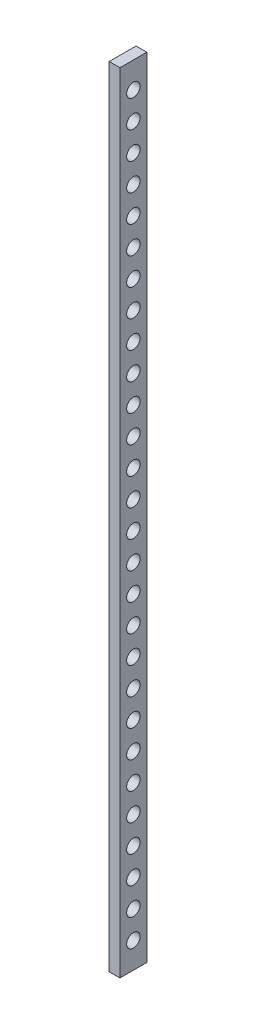
ISO-10303-21;
HEADER;
FILE_DESCRIPTION(('STEP AP214'),'2;1');
FILE_NAME('part.step','',(''),(''),'','','');
FILE_SCHEMA(('AUTOMOTIVE_DESIGN { 1 0 10303 214 1 1 1 1 }'));
ENDSEC;
DATA;
#1=APPLICATION_CONTEXT('core data for automotive mechanical design processes');
#2=APPLICATION_PROTOCOL_DEFINITION('international standard','automotive_design',2000,#1);
#3=PRODUCT_CONTEXT('',#1,'mechanical');
#4=PRODUCT('Part','Part','',(#3));
#5=PRODUCT_RELATED_PRODUCT_CATEGORY('part','',(#4));
#6=PRODUCT_DEFINITION_FORMATION('','',#4);
#7=PRODUCT_DEFINITION_CONTEXT('part definition',#1,'design');
#8=PRODUCT_DEFINITION('design','',#6,#7);
#9=PRODUCT_DEFINITION_SHAPE('','',#8);
#10=(LENGTH_UNIT() NAMED_UNIT(*) SI_UNIT(.MILLI.,.METRE.));
#11=(NAMED_UNIT(*) PLANE_ANGLE_UNIT() SI_UNIT($,.RADIAN.));
#12=(NAMED_UNIT(*) SI_UNIT($,.STERADIAN.) SOLID_ANGLE_UNIT());
#13=UNCERTAINTY_MEASURE_WITH_UNIT(LENGTH_MEASURE(1.E-05),#10,'distance_accuracy_value','');
#14=(GEOMETRIC_REPRESENTATION_CONTEXT(3) GLOBAL_UNCERTAINTY_ASSIGNED_CONTEXT((#13)) GLOBAL_UNIT_ASSIGNED_CONTEXT((#10,
#11,#12)) REPRESENTATION_CONTEXT('',''));
#15=CARTESIAN_POINT('',(0.,0.,0.));
#16=DIRECTION('',(0.,0.,1.));
#17=DIRECTION('',(1.,0.,0.));
#18=AXIS2_PLACEMENT_3D('',#15,#16,#17);
#19=CARTESIAN_POINT('',(-0.999999999999586,215.65,-2.5));
#20=DIRECTION('',(-1.,0.,0.));
#21=DIRECTION('',(0.,0.,1.));
#22=AXIS2_PLACEMENT_3D('',#19,#20,#21);
#23=PLANE('',#22);
#24=CARTESIAN_POINT('',(-0.999999999999595,210.82,0.));
#25=DIRECTION('',(-1.,0.,0.));
#26=DIRECTION('',(0.,-1.,0.));
#27=AXIS2_PLACEMENT_3D('',#24,#25,#26);
#28=CIRCLE('',#27,1.25);
#29=CARTESIAN_POINT('',(-0.999999999999597,209.57,0.));
#30=VERTEX_POINT('',#29);
#31=EDGE_CURVE('E108',#30,#30,#28,.F.);
#32=ORIENTED_EDGE('',*,*,#31,.T.);
#33=EDGE_LOOP('',(#32));
#34=FACE_BOUND('',#33,.T.);
#35=CARTESIAN_POINT('',(-0.999999999999605,205.74,0.));
#36=DIRECTION('',(-1.,0.,0.));
#37=DIRECTION('',(0.,-1.,0.));
#38=AXIS2_PLACEMENT_3D('',#35,#36,#37);
#39=CIRCLE('',#38,1.25);
#40=CARTESIAN_POINT('',(-0.999999999999607,204.49,0.));
#41=VERTEX_POINT('',#40);
#42=EDGE_CURVE('E112',#41,#41,#39,.F.);
#43=ORIENTED_EDGE('',*,*,#42,.T.);
#44=EDGE_LOOP('',(#43));
#45=FACE_BOUND('',#44,.T.);
#46=CARTESIAN_POINT('',(-0.999999999999616,200.66,0.));
#47=DIRECTION('',(-1.,0.,0.));
#48=DIRECTION('',(0.,-1.,0.));
#49=AXIS2_PLACEMENT_3D('',#46,#47,#48);
#50=CIRCLE('',#49,1.25);
#51=CARTESIAN_POINT('',(-0.999999999999618,199.41,0.));
#52=VERTEX_POINT('',#51);
#53=EDGE_CURVE('E118',#52,#52,#50,.F.);
#54=ORIENTED_EDGE('',*,*,#53,.T.);
#55=EDGE_LOOP('',(#54));
#56=FACE_BOUND('',#55,.T.);
#57=CARTESIAN_POINT('',(-0.999999999999625,195.58,0.));
#58=DIRECTION('',(-1.,0.,0.));
#59=DIRECTION('',(0.,-1.,0.));
#60=AXIS2_PLACEMENT_3D('',#57,#58,#59);
#61=CIRCLE('',#60,1.25);
#62=CARTESIAN_POINT('',(-0.999999999999627,194.33,0.));
#63=VERTEX_POINT('',#62);
#64=EDGE_CURVE('E124',#63,#63,#61,.F.);
#65=ORIENTED_EDGE('',*,*,#64,.T.);
#66=EDGE_LOOP('',(#65));
#67=FACE_BOUND('',#66,.T.);
#68=CARTESIAN_POINT('',(-0.999999999999634,190.5,0.));
#69=DIRECTION('',(-1.,0.,0.));
#70=DIRECTION('',(0.,-1.,0.));
#71=AXIS2_PLACEMENT_3D('',#68,#69,#70);
#72=CIRCLE('',#71,1.25);
#73=CARTESIAN_POINT('',(-0.999999999999637,189.25,0.));
#74=VERTEX_POINT('',#73);
#75=EDGE_CURVE('E130',#74,#74,#72,.F.);
#76=ORIENTED_EDGE('',*,*,#75,.T.);
#77=EDGE_LOOP('',(#76));
#78=FACE_BOUND('',#77,.T.);
#79=CARTESIAN_POINT('',(-0.999999999999644,185.42,0.));
#80=DIRECTION('',(-1.,0.,0.));
#81=DIRECTION('',(0.,-1.,0.));
#82=AXIS2_PLACEMENT_3D('',#79,#80,#81);
#83=CIRCLE('',#82,1.25);
#84=CARTESIAN_POINT('',(-0.999999999999647,184.17,0.));
#85=VERTEX_POINT('',#84);
#86=EDGE_CURVE('E136',#85,#85,#83,.F.);
#87=ORIENTED_EDGE('',*,*,#86,.T.);
#88=EDGE_LOOP('',(#87));
#89=FACE_BOUND('',#88,.T.);
#90=CARTESIAN_POINT('',(-0.999999999999654,180.34,0.));
#91=DIRECTION('',(-1.,0.,0.));
#92=DIRECTION('',(0.,-1.,0.));
#93=AXIS2_PLACEMENT_3D('',#90,#91,#92);
#94=CIRCLE('',#93,1.25);
#95=CARTESIAN_POINT('',(-0.999999999999656,179.09,0.));
#96=VERTEX_POINT('',#95);
#97=EDGE_CURVE('E142',#96,#96,#94,.F.);
#98=ORIENTED_EDGE('',*,*,#97,.T.);
#99=EDGE_LOOP('',(#98));
#100=FACE_BOUND('',#99,.T.);
#101=CARTESIAN_POINT('',(-0.999999999999664,175.26,0.));
#102=DIRECTION('',(-1.,0.,0.));
#103=DIRECTION('',(0.,-1.,0.));
#104=AXIS2_PLACEMENT_3D('',#101,#102,#103);
#105=CIRCLE('',#104,1.25);
#106=CARTESIAN_POINT('',(-0.999999999999666,174.01,0.));
#107=VERTEX_POINT('',#106);
#108=EDGE_CURVE('E148',#107,#107,#105,.F.);
#109=ORIENTED_EDGE('',*,*,#108,.T.);
#110=EDGE_LOOP('',(#109));
#111=FACE_BOUND('',#110,.T.);
#112=CARTESIAN_POINT('',(-0.999999999999673,170.18,0.));
#113=DIRECTION('',(-1.,0.,0.));
#114=DIRECTION('',(0.,-1.,0.));
#115=AXIS2_PLACEMENT_3D('',#112,#113,#114);
#116=CIRCLE('',#115,1.25);
#117=CARTESIAN_POINT('',(-0.999999999999675,168.93,0.));
#118=VERTEX_POINT('',#117);
#119=EDGE_CURVE('E154',#118,#118,#116,.F.);
#120=ORIENTED_EDGE('',*,*,#119,.T.);
#121=EDGE_LOOP('',(#120));
#122=FACE_BOUND('',#121,.T.);
#123=CARTESIAN_POINT('',(-0.999999999999683,165.1,0.));
#124=DIRECTION('',(-1.,0.,0.));
#125=DIRECTION('',(0.,-1.,0.));
#126=AXIS2_PLACEMENT_3D('',#123,#124,#125);
#127=CIRCLE('',#126,1.25);
#128=CARTESIAN_POINT('',(-0.999999999999685,163.85,0.));
#129=VERTEX_POINT('',#128);
#130=EDGE_CURVE('E160',#129,#129,#127,.F.);
#131=ORIENTED_EDGE('',*,*,#130,.T.);
#132=EDGE_LOOP('',(#131));
#133=FACE_BOUND('',#132,.T.);
#134=CARTESIAN_POINT('',(-0.999999999999694,160.02,0.));
#135=DIRECTION('',(-1.,0.,0.));
#136=DIRECTION('',(0.,-1.,0.));
#137=AXIS2_PLACEMENT_3D('',#134,#135,#136);
#138=CIRCLE('',#137,1.25);
#139=CARTESIAN_POINT('',(-0.999999999999696,158.77,0.));
#140=VERTEX_POINT('',#139);
#141=EDGE_CURVE('E166',#140,#140,#138,.F.);
#142=ORIENTED_EDGE('',*,*,#141,.T.);
#143=EDGE_LOOP('',(#142));
#144=FACE_BOUND('',#143,.T.);
#145=CARTESIAN_POINT('',(-0.999999999999704,154.94,0.));
#146=DIRECTION('',(-1.,0.,0.));
#147=DIRECTION('',(0.,-1.,0.));
#148=AXIS2_PLACEMENT_3D('',#145,#146,#147);
#149=CIRCLE('',#148,1.25);
#150=CARTESIAN_POINT('',(-0.999999999999706,153.69,0.));
#151=VERTEX_POINT('',#150);
#152=EDGE_CURVE('E172',#151,#151,#149,.F.);
#153=ORIENTED_EDGE('',*,*,#152,.T.);
#154=EDGE_LOOP('',(#153));
#155=FACE_BOUND('',#154,.T.);
#156=CARTESIAN_POINT('',(-0.999999999999713,149.86,0.));
#157=DIRECTION('',(-1.,0.,0.));
#158=DIRECTION('',(0.,-1.,0.));
#159=AXIS2_PLACEMENT_3D('',#156,#157,#158);
#160=CIRCLE('',#159,1.25);
#161=CARTESIAN_POINT('',(-0.999999999999716,148.61,0.));
#162=VERTEX_POINT('',#161);
#163=EDGE_CURVE('E178',#162,#162,#160,.F.);
#164=ORIENTED_EDGE('',*,*,#163,.T.);
#165=EDGE_LOOP('',(#164));
#166=FACE_BOUND('',#165,.T.);
#167=CARTESIAN_POINT('',(-0.999999999999723,144.78,0.));
#168=DIRECTION('',(-1.,0.,0.));
#169=DIRECTION('',(0.,-1.,0.));
#170=AXIS2_PLACEMENT_3D('',#167,#168,#169);
#171=CIRCLE('',#170,1.25);
#172=CARTESIAN_POINT('',(-0.999999999999726,143.53,0.));
#173=VERTEX_POINT('',#172);
#174=EDGE_CURVE('E184',#173,#173,#171,.F.);
#175=ORIENTED_EDGE('',*,*,#174,.T.);
#176=EDGE_LOOP('',(#175));
#177=FACE_BOUND('',#176,.T.);
#178=CARTESIAN_POINT('',(-0.999999999999732,139.7,0.));
#179=DIRECTION('',(-1.,0.,0.));
#180=DIRECTION('',(0.,-1.,0.));
#181=AXIS2_PLACEMENT_3D('',#178,#179,#180);
#182=CIRCLE('',#181,1.25);
#183=CARTESIAN_POINT('',(-0.999999999999735,138.45,0.));
#184=VERTEX_POINT('',#183);
#185=EDGE_CURVE('E190',#184,#184,#182,.F.);
#186=ORIENTED_EDGE('',*,*,#185,.T.);
#187=EDGE_LOOP('',(#186));
#188=FACE_BOUND('',#187,.T.);
#189=CARTESIAN_POINT('',(-0.999999999999742,134.62,0.));
#190=DIRECTION('',(-1.,0.,0.));
#191=DIRECTION('',(0.,-1.,0.));
#192=AXIS2_PLACEMENT_3D('',#189,#190,#191);
#193=CIRCLE('',#192,1.25);
#194=CARTESIAN_POINT('',(-0.999999999999745,133.37,0.));
#195=VERTEX_POINT('',#194);
#196=EDGE_CURVE('E196',#195,#195,#193,.F.);
#197=ORIENTED_EDGE('',*,*,#196,.T.);
#198=EDGE_LOOP('',(#197));
#199=FACE_BOUND('',#198,.T.);
#200=CARTESIAN_POINT('',(-0.999999999999752,129.54,0.));
#201=DIRECTION('',(-1.,0.,0.));
#202=DIRECTION('',(0.,-1.,0.));
#203=AXIS2_PLACEMENT_3D('',#200,#201,#202);
#204=CIRCLE('',#203,1.25);
#205=CARTESIAN_POINT('',(-0.999999999999755,128.29,0.));
#206=VERTEX_POINT('',#205);
#207=EDGE_CURVE('E202',#206,#206,#204,.F.);
#208=ORIENTED_EDGE('',*,*,#207,.T.);
#209=EDGE_LOOP('',(#208));
#210=FACE_BOUND('',#209,.T.);
#211=CARTESIAN_POINT('',(-0.99999999999976,124.46,0.));
#212=DIRECTION('',(-1.,0.,0.));
#213=DIRECTION('',(0.,-1.,0.));
#214=AXIS2_PLACEMENT_3D('',#211,#212,#213);
#215=CIRCLE('',#214,1.25);
#216=CARTESIAN_POINT('',(-0.999999999999763,123.21,0.));
#217=VERTEX_POINT('',#216);
#218=EDGE_CURVE('E208',#217,#217,#215,.F.);
#219=ORIENTED_EDGE('',*,*,#218,.T.);
#220=EDGE_LOOP('',(#219));
#221=FACE_BOUND('',#220,.T.);
#222=CARTESIAN_POINT('',(-0.999999999999769,119.38,0.));
#223=DIRECTION('',(-1.,0.,0.));
#224=DIRECTION('',(0.,-1.,0.));
#225=AXIS2_PLACEMENT_3D('',#222,#223,#224);
#226=CIRCLE('',#225,1.25);
#227=CARTESIAN_POINT('',(-0.999999999999772,118.13,0.));
#228=VERTEX_POINT('',#227);
#229=EDGE_CURVE('E214',#228,#228,#226,.F.);
#230=ORIENTED_EDGE('',*,*,#229,.T.);
#231=EDGE_LOOP('',(#230));
#232=FACE_BOUND('',#231,.T.);
#233=CARTESIAN_POINT('',(-0.999999999999779,114.3,0.));
#234=DIRECTION('',(-1.,0.,0.));
#235=DIRECTION('',(0.,-1.,0.));
#236=AXIS2_PLACEMENT_3D('',#233,#234,#235);
#237=CIRCLE('',#236,1.25);
#238=CARTESIAN_POINT('',(-0.999999999999781,113.05,0.));
#239=VERTEX_POINT('',#238);
#240=EDGE_CURVE('E220',#239,#239,#237,.F.);
#241=ORIENTED_EDGE('',*,*,#240,.T.);
#242=EDGE_LOOP('',(#241));
#243=FACE_BOUND('',#242,.T.);
#244=CARTESIAN_POINT('',(-0.999999999999789,109.22,0.));
#245=DIRECTION('',(-1.,0.,0.));
#246=DIRECTION('',(0.,-1.,0.));
#247=AXIS2_PLACEMENT_3D('',#244,#245,#246);
#248=CIRCLE('',#247,1.25);
#249=CARTESIAN_POINT('',(-0.999999999999791,107.97,0.));
#250=VERTEX_POINT('',#249);
#251=EDGE_CURVE('E226',#250,#250,#248,.F.);
#252=ORIENTED_EDGE('',*,*,#251,.T.);
#253=EDGE_LOOP('',(#252));
#254=FACE_BOUND('',#253,.T.);
#255=CARTESIAN_POINT('',(-0.999999999999798,104.14,0.));
#256=DIRECTION('',(-1.,0.,0.));
#257=DIRECTION('',(0.,-1.,0.));
#258=AXIS2_PLACEMENT_3D('',#255,#256,#257);
#259=CIRCLE('',#258,1.25);
#260=CARTESIAN_POINT('',(-0.9999999999998,102.89,0.));
#261=VERTEX_POINT('',#260);
#262=EDGE_CURVE('E232',#261,#261,#259,.F.);
#263=ORIENTED_EDGE('',*,*,#262,.T.);
#264=EDGE_LOOP('',(#263));
#265=FACE_BOUND('',#264,.T.);
#266=CARTESIAN_POINT('',(-0.999999999999809,99.06,0.));
#267=DIRECTION('',(-1.,0.,0.));
#268=DIRECTION('',(0.,-1.,0.));
#269=AXIS2_PLACEMENT_3D('',#266,#267,#268);
#270=CIRCLE('',#269,1.25);
#271=CARTESIAN_POINT('',(-0.999999999999811,97.81,0.));
#272=VERTEX_POINT('',#271);
#273=EDGE_CURVE('E238',#272,#272,#270,.F.);
#274=ORIENTED_EDGE('',*,*,#273,.T.);
#275=EDGE_LOOP('',(#274));
#276=FACE_BOUND('',#275,.T.);
#277=CARTESIAN_POINT('',(-0.999999999999818,93.98,0.));
#278=DIRECTION('',(-1.,0.,0.));
#279=DIRECTION('',(0.,-1.,0.));
#280=AXIS2_PLACEMENT_3D('',#277,#278,#279);
#281=CIRCLE('',#280,1.25);
#282=CARTESIAN_POINT('',(-0.999999999999821,92.73,0.));
#283=VERTEX_POINT('',#282);
#284=EDGE_CURVE('E244',#283,#283,#281,.F.);
#285=ORIENTED_EDGE('',*,*,#284,.T.);
#286=EDGE_LOOP('',(#285));
#287=FACE_BOUND('',#286,.T.);
#288=CARTESIAN_POINT('',(-0.999999999999828,88.9,0.));
#289=DIRECTION('',(-1.,0.,0.));
#290=DIRECTION('',(0.,-1.,0.));
#291=AXIS2_PLACEMENT_3D('',#288,#289,#290);
#292=CIRCLE('',#291,1.25);
#293=CARTESIAN_POINT('',(-0.999999999999831,87.65,0.));
#294=VERTEX_POINT('',#293);
#295=EDGE_CURVE('E250',#294,#294,#292,.F.);
#296=ORIENTED_EDGE('',*,*,#295,.T.);
#297=EDGE_LOOP('',(#296));
#298=FACE_BOUND('',#297,.T.);
#299=CARTESIAN_POINT('',(-0.999999999999837,83.82,0.));
#300=DIRECTION('',(-1.,0.,0.));
#301=DIRECTION('',(0.,-1.,0.));
#302=AXIS2_PLACEMENT_3D('',#299,#300,#301);
#303=CIRCLE('',#302,1.25);
#304=CARTESIAN_POINT('',(-0.99999999999984,82.57,0.));
#305=VERTEX_POINT('',#304);
#306=EDGE_CURVE('E256',#305,#305,#303,.F.);
#307=ORIENTED_EDGE('',*,*,#306,.T.);
#308=EDGE_LOOP('',(#307));
#309=FACE_BOUND('',#308,.T.);
#310=CARTESIAN_POINT('',(-0.999999999999847,78.74,0.));
#311=DIRECTION('',(-1.,0.,0.));
#312=DIRECTION('',(0.,-1.,0.));
#313=AXIS2_PLACEMENT_3D('',#310,#311,#312);
#314=CIRCLE('',#313,1.25);
#315=CARTESIAN_POINT('',(-0.99999999999985,77.49,0.));
#316=VERTEX_POINT('',#315);
#317=EDGE_CURVE('E39',#316,#316,#314,.F.);
#318=ORIENTED_EDGE('',*,*,#317,.T.);
#319=EDGE_LOOP('',(#318));
#320=FACE_BOUND('',#319,.T.);
#321=CARTESIAN_POINT('',(-0.999999999999857,73.66,0.));
#322=DIRECTION('',(-1.,0.,0.));
#323=DIRECTION('',(0.,-1.,0.));
#324=AXIS2_PLACEMENT_3D('',#321,#322,#323);
#325=CIRCLE('',#324,1.25);
#326=CARTESIAN_POINT('',(-0.999999999999859,72.41,0.));
#327=VERTEX_POINT('',#326);
#328=EDGE_CURVE('E104',#327,#327,#325,.F.);
#329=ORIENTED_EDGE('',*,*,#328,.T.);
#330=EDGE_LOOP('',(#329));
#331=FACE_BOUND('',#330,.T.);
#332=DIRECTION('',(0.,0.,1.));
#333=VECTOR('',#332,1.);
#334=CARTESIAN_POINT('',(-0.999999999999586,215.65,0.));
#335=LINE('',#334,#333);
#336=CARTESIAN_POINT('',(-0.999999999999656,215.65,-2.5));
#337=VERTEX_POINT('',#336);
#338=CARTESIAN_POINT('',(-0.999999999999586,215.65,2.5));
#339=VERTEX_POINT('',#338);
#340=EDGE_CURVE('E74',#337,#339,#335,.T.);
#341=ORIENTED_EDGE('',*,*,#340,.F.);
#342=DIRECTION('',(0.,1.,0.));
#343=VECTOR('',#342,1.);
#344=CARTESIAN_POINT('',(-0.999999999999868,215.65,-2.5));
#345=LINE('',#344,#343);
#346=CARTESIAN_POINT('',(-0.999999999999797,68.8300000000001,-2.5));
#347=VERTEX_POINT('',#346);
#348=EDGE_CURVE('E88',#347,#337,#345,.T.);
#349=ORIENTED_EDGE('',*,*,#348,.F.);
#350=DIRECTION('',(0.,0.,1.));
#351=VECTOR('',#350,1.);
#352=CARTESIAN_POINT('',(-0.999999999999868,68.8300000000001,0.));
#353=LINE('',#352,#351);
#354=CARTESIAN_POINT('',(-0.999999999999727,68.8300000000001,2.5));
#355=VERTEX_POINT('',#354);
#356=EDGE_CURVE('E79',#347,#355,#353,.T.);
#357=ORIENTED_EDGE('',*,*,#356,.T.);
#358=DIRECTION('',(0.,1.,0.));
#359=VECTOR('',#358,1.);
#360=CARTESIAN_POINT('',(-0.999999999999586,215.65,2.5));
#361=LINE('',#360,#359);
#362=EDGE_CURVE('E106',#339,#355,#361,.F.);
#363=ORIENTED_EDGE('',*,*,#362,.F.);
#364=EDGE_LOOP('',(#341,#349,#357,#363));
#365=FACE_BOUND('',#364,.T.);
#366=ADVANCED_FACE('F35',(#34,#45,#56,#67,#78,#89,#100,#111,#122,#133,#144,#155,#166,#177,#188,
#199,#210,#221,#232,#243,#254,#265,#276,#287,#298,#309,#320,#331,#365),#23,.T.);
#367=CARTESIAN_POINT('',(1.318556E-13,68.8300000000001,0.));
#368=DIRECTION('',(0.,1.,0.));
#369=DIRECTION('',(0.,0.,1.));
#370=AXIS2_PLACEMENT_3D('',#367,#368,#369);
#371=PLANE('',#370);
#372=ORIENTED_EDGE('',*,*,#356,.F.);
#373=DIRECTION('',(-1.,0.,0.));
#374=VECTOR('',#373,1.);
#375=CARTESIAN_POINT('',(1.00000000000042,68.8300000000001,-2.5));
#376=LINE('',#375,#374);
#377=CARTESIAN_POINT('',(1.00000000000027,68.8300000000001,-2.5));
#378=VERTEX_POINT('',#377);
#379=EDGE_CURVE('E82',#378,#347,#376,.T.);
#380=ORIENTED_EDGE('',*,*,#379,.F.);
#381=DIRECTION('',(0.,0.,-1.));
#382=VECTOR('',#381,1.);
#383=CARTESIAN_POINT('',(1.00000000000041,68.8300000000001,2.5));
#384=LINE('',#383,#382);
#385=CARTESIAN_POINT('',(1.0000000000002,68.8300000000001,2.5));
#386=VERTEX_POINT('',#385);
#387=EDGE_CURVE('E111',#386,#378,#384,.T.);
#388=ORIENTED_EDGE('',*,*,#387,.F.);
#389=DIRECTION('',(1.,0.,0.));
#390=VECTOR('',#389,1.);
#391=CARTESIAN_POINT('',(-0.999999999999586,68.8300000000001,2.5));
#392=LINE('',#391,#390);
#393=EDGE_CURVE('E85',#355,#386,#392,.T.);
#394=ORIENTED_EDGE('',*,*,#393,.F.);
#395=EDGE_LOOP('',(#372,#380,#388,#394));
#396=FACE_BOUND('',#395,.T.);
#397=ADVANCED_FACE('F80',(#396),#371,.F.);
#398=CARTESIAN_POINT('',(1.00000000000042,215.65,-2.5));
#399=DIRECTION('',(0.,0.,-1.));
#400=DIRECTION('',(-1.,0.,0.));
#401=AXIS2_PLACEMENT_3D('',#398,#399,#400);
#402=PLANE('',#401);
#403=DIRECTION('',(1.,0.,0.));
#404=VECTOR('',#403,1.);
#405=CARTESIAN_POINT('',(4.139632E-13,215.65,-2.5));
#406=LINE('',#405,#404);
#407=CARTESIAN_POINT('',(1.00000000000041,215.65,-2.5));
#408=VERTEX_POINT('',#407);
#409=EDGE_CURVE('E730',#408,#337,#406,.F.);
#410=ORIENTED_EDGE('',*,*,#409,.F.);
#411=DIRECTION('',(0.,1.,0.));
#412=VECTOR('',#411,1.);
#413=CARTESIAN_POINT('',(1.00000000000041,215.65,-2.5));
#414=LINE('',#413,#412);
#415=EDGE_CURVE('E94',#378,#408,#414,.T.);
#416=ORIENTED_EDGE('',*,*,#415,.F.);
#417=ORIENTED_EDGE('',*,*,#379,.T.);
#418=ORIENTED_EDGE('',*,*,#348,.T.);
#419=EDGE_LOOP('',(#410,#416,#417,#418));
#420=FACE_BOUND('',#419,.T.);
#421=ADVANCED_FACE('F92',(#420),#402,.T.);
#422=CARTESIAN_POINT('',(4.139632E-13,215.65,0.));
#423=DIRECTION('',(0.,1.,0.));
#424=DIRECTION('',(0.,0.,1.));
#425=AXIS2_PLACEMENT_3D('',#422,#423,#424);
#426=PLANE('',#425);
#427=DIRECTION('',(0.,0.,-1.));
#428=VECTOR('',#427,1.);
#429=CARTESIAN_POINT('',(1.00000000000041,215.65,2.5));
#430=LINE('',#429,#428);
#431=CARTESIAN_POINT('',(1.00000000000034,215.65,2.5));
#432=VERTEX_POINT('',#431);
#433=EDGE_CURVE('E729',#408,#432,#430,.F.);
#434=ORIENTED_EDGE('',*,*,#433,.F.);
#435=ORIENTED_EDGE('',*,*,#409,.T.);
#436=ORIENTED_EDGE('',*,*,#340,.T.);
#437=DIRECTION('',(1.,0.,0.));
#438=VECTOR('',#437,1.);
#439=CARTESIAN_POINT('',(-0.999999999999586,215.65,2.5));
#440=LINE('',#439,#438);
#441=EDGE_CURVE('E54',#432,#339,#440,.F.);
#442=ORIENTED_EDGE('',*,*,#441,.F.);
#443=EDGE_LOOP('',(#434,#435,#436,#442));
#444=FACE_BOUND('',#443,.T.);
#445=ADVANCED_FACE('F288',(#444),#426,.T.);
#446=CARTESIAN_POINT('',(-0.999999999999586,215.65,2.5));
#447=DIRECTION('',(0.,0.,1.));
#448=DIRECTION('',(1.,0.,0.));
#449=AXIS2_PLACEMENT_3D('',#446,#447,#448);
#450=PLANE('',#449);
#451=ORIENTED_EDGE('',*,*,#441,.T.);
#452=ORIENTED_EDGE('',*,*,#362,.T.);
#453=ORIENTED_EDGE('',*,*,#393,.T.);
#454=DIRECTION('',(0.,1.,0.));
#455=VECTOR('',#454,1.);
#456=CARTESIAN_POINT('',(1.00000000000041,215.65,2.5));
#457=LINE('',#456,#455);
#458=EDGE_CURVE('E103',#432,#386,#457,.F.);
#459=ORIENTED_EDGE('',*,*,#458,.F.);
#460=EDGE_LOOP('',(#451,#452,#453,#459));
#461=FACE_BOUND('',#460,.T.);
#462=ADVANCED_FACE('F282',(#461),#450,.T.);
#463=CARTESIAN_POINT('',(1.00000000000016,73.66,0.));
#464=DIRECTION('',(-1.,0.,0.));
#465=DIRECTION('',(0.,-1.,0.));
#466=AXIS2_PLACEMENT_3D('',#463,#464,#465);
#467=CYLINDRICAL_SURFACE('',#466,1.25);
#468=CARTESIAN_POINT('',(1.00000000000016,73.66,0.));
#469=DIRECTION('',(-1.,0.,0.));
#470=DIRECTION('',(0.,-1.,0.));
#471=AXIS2_PLACEMENT_3D('',#468,#469,#470);
#472=CIRCLE('',#471,1.25);
#473=CARTESIAN_POINT('',(1.00000000000016,72.41,0.));
#474=VERTEX_POINT('',#473);
#475=EDGE_CURVE('E99',#474,#474,#472,.T.);
#476=ORIENTED_EDGE('',*,*,#475,.F.);
#477=EDGE_LOOP('',(#476));
#478=FACE_BOUND('',#477,.T.);
#479=ORIENTED_EDGE('',*,*,#328,.F.);
#480=EDGE_LOOP('',(#479));
#481=FACE_BOUND('',#480,.T.);
#482=ADVANCED_FACE('F270',(#478,#481),#467,.F.);
#483=CARTESIAN_POINT('',(1.00000000000017,78.74,0.));
#484=DIRECTION('',(-1.,0.,0.));
#485=DIRECTION('',(0.,-1.,0.));
#486=AXIS2_PLACEMENT_3D('',#483,#484,#485);
#487=CYLINDRICAL_SURFACE('',#486,1.25);
#488=CARTESIAN_POINT('',(1.00000000000017,78.74,0.));
#489=DIRECTION('',(-1.,0.,0.));
#490=DIRECTION('',(0.,-1.,0.));
#491=AXIS2_PLACEMENT_3D('',#488,#489,#490);
#492=CIRCLE('',#491,1.25);
#493=CARTESIAN_POINT('',(1.00000000000017,77.49,0.));
#494=VERTEX_POINT('',#493);
#495=EDGE_CURVE('E102',#494,#494,#492,.T.);
#496=ORIENTED_EDGE('',*,*,#495,.F.);
#497=EDGE_LOOP('',(#496));
#498=FACE_BOUND('',#497,.T.);
#499=ORIENTED_EDGE('',*,*,#317,.F.);
#500=EDGE_LOOP('',(#499));
#501=FACE_BOUND('',#500,.T.);
#502=ADVANCED_FACE('F266',(#498,#501),#487,.F.);
#503=CARTESIAN_POINT('',(1.00000000000018,83.82,0.));
#504=DIRECTION('',(-1.,0.,0.));
#505=DIRECTION('',(0.,-1.,0.));
#506=AXIS2_PLACEMENT_3D('',#503,#504,#505);
#507=CYLINDRICAL_SURFACE('',#506,1.25);
#508=CARTESIAN_POINT('',(1.00000000000018,83.82,0.));
#509=DIRECTION('',(-1.,0.,0.));
#510=DIRECTION('',(0.,-1.,0.));
#511=AXIS2_PLACEMENT_3D('',#508,#509,#510);
#512=CIRCLE('',#511,1.25);
#513=CARTESIAN_POINT('',(1.00000000000018,82.57,0.));
#514=VERTEX_POINT('',#513);
#515=EDGE_CURVE('E253',#514,#514,#512,.T.);
#516=ORIENTED_EDGE('',*,*,#515,.F.);
#517=EDGE_LOOP('',(#516));
#518=FACE_BOUND('',#517,.T.);
#519=ORIENTED_EDGE('',*,*,#306,.F.);
#520=EDGE_LOOP('',(#519));
#521=FACE_BOUND('',#520,.T.);
#522=ADVANCED_FACE('F269',(#518,#521),#507,.F.);
#523=CARTESIAN_POINT('',(1.00000000000019,88.9,0.));
#524=DIRECTION('',(-1.,0.,0.));
#525=DIRECTION('',(0.,-1.,0.));
#526=AXIS2_PLACEMENT_3D('',#523,#524,#525);
#527=CYLINDRICAL_SURFACE('',#526,1.25);
#528=CARTESIAN_POINT('',(1.00000000000019,88.9,0.));
#529=DIRECTION('',(-1.,0.,0.));
#530=DIRECTION('',(0.,-1.,0.));
#531=AXIS2_PLACEMENT_3D('',#528,#529,#530);
#532=CIRCLE('',#531,1.25);
#533=CARTESIAN_POINT('',(1.00000000000019,87.65,0.));
#534=VERTEX_POINT('',#533);
#535=EDGE_CURVE('E247',#534,#534,#532,.T.);
#536=ORIENTED_EDGE('',*,*,#535,.F.);
#537=EDGE_LOOP('',(#536));
#538=FACE_BOUND('',#537,.T.);
#539=ORIENTED_EDGE('',*,*,#295,.F.);
#540=EDGE_LOOP('',(#539));
#541=FACE_BOUND('',#540,.T.);
#542=ADVANCED_FACE('F346',(#538,#541),#527,.F.);
#543=CARTESIAN_POINT('',(1.0000000000002,93.98,0.));
#544=DIRECTION('',(-1.,0.,0.));
#545=DIRECTION('',(0.,-1.,0.));
#546=AXIS2_PLACEMENT_3D('',#543,#544,#545);
#547=CYLINDRICAL_SURFACE('',#546,1.25);
#548=CARTESIAN_POINT('',(1.0000000000002,93.98,0.));
#549=DIRECTION('',(-1.,0.,0.));
#550=DIRECTION('',(0.,-1.,0.));
#551=AXIS2_PLACEMENT_3D('',#548,#549,#550);
#552=CIRCLE('',#551,1.25);
#553=CARTESIAN_POINT('',(1.0000000000002,92.73,0.));
#554=VERTEX_POINT('',#553);
#555=EDGE_CURVE('E241',#554,#554,#552,.T.);
#556=ORIENTED_EDGE('',*,*,#555,.F.);
#557=EDGE_LOOP('',(#556));
#558=FACE_BOUND('',#557,.T.);
#559=ORIENTED_EDGE('',*,*,#284,.F.);
#560=EDGE_LOOP('',(#559));
#561=FACE_BOUND('',#560,.T.);
#562=ADVANCED_FACE('F355',(#558,#561),#547,.F.);
#563=CARTESIAN_POINT('',(1.00000000000021,99.06,0.));
#564=DIRECTION('',(-1.,0.,0.));
#565=DIRECTION('',(0.,-1.,0.));
#566=AXIS2_PLACEMENT_3D('',#563,#564,#565);
#567=CYLINDRICAL_SURFACE('',#566,1.25);
#568=CARTESIAN_POINT('',(1.00000000000021,99.06,0.));
#569=DIRECTION('',(-1.,0.,0.));
#570=DIRECTION('',(0.,-1.,0.));
#571=AXIS2_PLACEMENT_3D('',#568,#569,#570);
#572=CIRCLE('',#571,1.25);
#573=CARTESIAN_POINT('',(1.0000000000002,97.81,0.));
#574=VERTEX_POINT('',#573);
#575=EDGE_CURVE('E235',#574,#574,#572,.T.);
#576=ORIENTED_EDGE('',*,*,#575,.F.);
#577=EDGE_LOOP('',(#576));
#578=FACE_BOUND('',#577,.T.);
#579=ORIENTED_EDGE('',*,*,#273,.F.);
#580=EDGE_LOOP('',(#579));
#581=FACE_BOUND('',#580,.T.);
#582=ADVANCED_FACE('F364',(#578,#581),#567,.F.);
#583=CARTESIAN_POINT('',(1.00000000000022,104.14,0.));
#584=DIRECTION('',(-1.,0.,0.));
#585=DIRECTION('',(0.,-1.,0.));
#586=AXIS2_PLACEMENT_3D('',#583,#584,#585);
#587=CYLINDRICAL_SURFACE('',#586,1.25);
#588=CARTESIAN_POINT('',(1.00000000000022,104.14,0.));
#589=DIRECTION('',(-1.,0.,0.));
#590=DIRECTION('',(0.,-1.,0.));
#591=AXIS2_PLACEMENT_3D('',#588,#589,#590);
#592=CIRCLE('',#591,1.25);
#593=CARTESIAN_POINT('',(1.00000000000021,102.89,0.));
#594=VERTEX_POINT('',#593);
#595=EDGE_CURVE('E229',#594,#594,#592,.T.);
#596=ORIENTED_EDGE('',*,*,#595,.F.);
#597=EDGE_LOOP('',(#596));
#598=FACE_BOUND('',#597,.T.);
#599=ORIENTED_EDGE('',*,*,#262,.F.);
#600=EDGE_LOOP('',(#599));
#601=FACE_BOUND('',#600,.T.);
#602=ADVANCED_FACE('F373',(#598,#601),#587,.F.);
#603=CARTESIAN_POINT('',(1.00000000000022,109.22,0.));
#604=DIRECTION('',(-1.,0.,0.));
#605=DIRECTION('',(0.,-1.,0.));
#606=AXIS2_PLACEMENT_3D('',#603,#604,#605);
#607=CYLINDRICAL_SURFACE('',#606,1.25);
#608=CARTESIAN_POINT('',(1.00000000000023,109.22,0.));
#609=DIRECTION('',(-1.,0.,0.));
#610=DIRECTION('',(0.,-1.,0.));
#611=AXIS2_PLACEMENT_3D('',#608,#609,#610);
#612=CIRCLE('',#611,1.25);
#613=CARTESIAN_POINT('',(1.00000000000022,107.97,0.));
#614=VERTEX_POINT('',#613);
#615=EDGE_CURVE('E223',#614,#614,#612,.T.);
#616=ORIENTED_EDGE('',*,*,#615,.F.);
#617=EDGE_LOOP('',(#616));
#618=FACE_BOUND('',#617,.T.);
#619=ORIENTED_EDGE('',*,*,#251,.F.);
#620=EDGE_LOOP('',(#619));
#621=FACE_BOUND('',#620,.T.);
#622=ADVANCED_FACE('F382',(#618,#621),#607,.F.);
#623=CARTESIAN_POINT('',(1.00000000000023,114.3,0.));
#624=DIRECTION('',(-1.,0.,0.));
#625=DIRECTION('',(0.,-1.,0.));
#626=AXIS2_PLACEMENT_3D('',#623,#624,#625);
#627=CYLINDRICAL_SURFACE('',#626,1.25);
#628=CARTESIAN_POINT('',(1.00000000000023,114.3,0.));
#629=DIRECTION('',(-1.,0.,0.));
#630=DIRECTION('',(0.,-1.,0.));
#631=AXIS2_PLACEMENT_3D('',#628,#629,#630);
#632=CIRCLE('',#631,1.25);
#633=CARTESIAN_POINT('',(1.00000000000023,113.05,0.));
#634=VERTEX_POINT('',#633);
#635=EDGE_CURVE('E217',#634,#634,#632,.T.);
#636=ORIENTED_EDGE('',*,*,#635,.F.);
#637=EDGE_LOOP('',(#636));
#638=FACE_BOUND('',#637,.T.);
#639=ORIENTED_EDGE('',*,*,#240,.F.);
#640=EDGE_LOOP('',(#639));
#641=FACE_BOUND('',#640,.T.);
#642=ADVANCED_FACE('F391',(#638,#641),#627,.F.);
#643=CARTESIAN_POINT('',(1.00000000000024,119.38,0.));
#644=DIRECTION('',(-1.,0.,0.));
#645=DIRECTION('',(0.,-1.,0.));
#646=AXIS2_PLACEMENT_3D('',#643,#644,#645);
#647=CYLINDRICAL_SURFACE('',#646,1.25);
#648=CARTESIAN_POINT('',(1.00000000000024,119.38,0.));
#649=DIRECTION('',(-1.,0.,0.));
#650=DIRECTION('',(0.,-1.,0.));
#651=AXIS2_PLACEMENT_3D('',#648,#649,#650);
#652=CIRCLE('',#651,1.25);
#653=CARTESIAN_POINT('',(1.00000000000024,118.13,0.));
#654=VERTEX_POINT('',#653);
#655=EDGE_CURVE('E211',#654,#654,#652,.T.);
#656=ORIENTED_EDGE('',*,*,#655,.F.);
#657=EDGE_LOOP('',(#656));
#658=FACE_BOUND('',#657,.T.);
#659=ORIENTED_EDGE('',*,*,#229,.F.);
#660=EDGE_LOOP('',(#659));
#661=FACE_BOUND('',#660,.T.);
#662=ADVANCED_FACE('F400',(#658,#661),#647,.F.);
#663=CARTESIAN_POINT('',(1.00000000000025,124.46,0.));
#664=DIRECTION('',(-1.,0.,0.));
#665=DIRECTION('',(0.,-1.,0.));
#666=AXIS2_PLACEMENT_3D('',#663,#664,#665);
#667=CYLINDRICAL_SURFACE('',#666,1.25);
#668=CARTESIAN_POINT('',(1.00000000000025,124.46,0.));
#669=DIRECTION('',(-1.,0.,0.));
#670=DIRECTION('',(0.,-1.,0.));
#671=AXIS2_PLACEMENT_3D('',#668,#669,#670);
#672=CIRCLE('',#671,1.25);
#673=CARTESIAN_POINT('',(1.00000000000025,123.21,0.));
#674=VERTEX_POINT('',#673);
#675=EDGE_CURVE('E205',#674,#674,#672,.T.);
#676=ORIENTED_EDGE('',*,*,#675,.F.);
#677=EDGE_LOOP('',(#676));
#678=FACE_BOUND('',#677,.T.);
#679=ORIENTED_EDGE('',*,*,#218,.F.);
#680=EDGE_LOOP('',(#679));
#681=FACE_BOUND('',#680,.T.);
#682=ADVANCED_FACE('F409',(#678,#681),#667,.F.);
#683=CARTESIAN_POINT('',(1.00000000000026,129.54,0.));
#684=DIRECTION('',(-1.,0.,0.));
#685=DIRECTION('',(0.,-1.,0.));
#686=AXIS2_PLACEMENT_3D('',#683,#684,#685);
#687=CYLINDRICAL_SURFACE('',#686,1.25);
#688=CARTESIAN_POINT('',(1.00000000000026,129.54,0.));
#689=DIRECTION('',(-1.,0.,0.));
#690=DIRECTION('',(0.,-1.,0.));
#691=AXIS2_PLACEMENT_3D('',#688,#689,#690);
#692=CIRCLE('',#691,1.25);
#693=CARTESIAN_POINT('',(1.00000000000026,128.29,0.));
#694=VERTEX_POINT('',#693);
#695=EDGE_CURVE('E199',#694,#694,#692,.T.);
#696=ORIENTED_EDGE('',*,*,#695,.F.);
#697=EDGE_LOOP('',(#696));
#698=FACE_BOUND('',#697,.T.);
#699=ORIENTED_EDGE('',*,*,#207,.F.);
#700=EDGE_LOOP('',(#699));
#701=FACE_BOUND('',#700,.T.);
#702=ADVANCED_FACE('F418',(#698,#701),#687,.F.);
#703=CARTESIAN_POINT('',(1.00000000000027,134.62,0.));
#704=DIRECTION('',(-1.,0.,0.));
#705=DIRECTION('',(0.,-1.,0.));
#706=AXIS2_PLACEMENT_3D('',#703,#704,#705);
#707=CYLINDRICAL_SURFACE('',#706,1.25);
#708=CARTESIAN_POINT('',(1.00000000000027,134.62,0.));
#709=DIRECTION('',(-1.,0.,0.));
#710=DIRECTION('',(0.,-1.,0.));
#711=AXIS2_PLACEMENT_3D('',#708,#709,#710);
#712=CIRCLE('',#711,1.25);
#713=CARTESIAN_POINT('',(1.00000000000027,133.37,0.));
#714=VERTEX_POINT('',#713);
#715=EDGE_CURVE('E193',#714,#714,#712,.T.);
#716=ORIENTED_EDGE('',*,*,#715,.F.);
#717=EDGE_LOOP('',(#716));
#718=FACE_BOUND('',#717,.T.);
#719=ORIENTED_EDGE('',*,*,#196,.F.);
#720=EDGE_LOOP('',(#719));
#721=FACE_BOUND('',#720,.T.);
#722=ADVANCED_FACE('F427',(#718,#721),#707,.F.);
#723=CARTESIAN_POINT('',(1.00000000000028,139.7,0.));
#724=DIRECTION('',(-1.,0.,0.));
#725=DIRECTION('',(0.,-1.,0.));
#726=AXIS2_PLACEMENT_3D('',#723,#724,#725);
#727=CYLINDRICAL_SURFACE('',#726,1.25);
#728=CARTESIAN_POINT('',(1.00000000000028,139.7,0.));
#729=DIRECTION('',(-1.,0.,0.));
#730=DIRECTION('',(0.,-1.,0.));
#731=AXIS2_PLACEMENT_3D('',#728,#729,#730);
#732=CIRCLE('',#731,1.25);
#733=CARTESIAN_POINT('',(1.00000000000028,138.45,0.));
#734=VERTEX_POINT('',#733);
#735=EDGE_CURVE('E187',#734,#734,#732,.T.);
#736=ORIENTED_EDGE('',*,*,#735,.F.);
#737=EDGE_LOOP('',(#736));
#738=FACE_BOUND('',#737,.T.);
#739=ORIENTED_EDGE('',*,*,#185,.F.);
#740=EDGE_LOOP('',(#739));
#741=FACE_BOUND('',#740,.T.);
#742=ADVANCED_FACE('F436',(#738,#741),#727,.F.);
#743=CARTESIAN_POINT('',(1.00000000000029,144.78,0.));
#744=DIRECTION('',(-1.,0.,0.));
#745=DIRECTION('',(0.,-1.,0.));
#746=AXIS2_PLACEMENT_3D('',#743,#744,#745);
#747=CYLINDRICAL_SURFACE('',#746,1.25);
#748=CARTESIAN_POINT('',(1.00000000000029,144.78,0.));
#749=DIRECTION('',(-1.,0.,0.));
#750=DIRECTION('',(0.,-1.,0.));
#751=AXIS2_PLACEMENT_3D('',#748,#749,#750);
#752=CIRCLE('',#751,1.25);
#753=CARTESIAN_POINT('',(1.00000000000029,143.53,0.));
#754=VERTEX_POINT('',#753);
#755=EDGE_CURVE('E181',#754,#754,#752,.T.);
#756=ORIENTED_EDGE('',*,*,#755,.F.);
#757=EDGE_LOOP('',(#756));
#758=FACE_BOUND('',#757,.T.);
#759=ORIENTED_EDGE('',*,*,#174,.F.);
#760=EDGE_LOOP('',(#759));
#761=FACE_BOUND('',#760,.T.);
#762=ADVANCED_FACE('F445',(#758,#761),#747,.F.);
#763=CARTESIAN_POINT('',(1.0000000000003,149.86,0.));
#764=DIRECTION('',(-1.,0.,0.));
#765=DIRECTION('',(0.,-1.,0.));
#766=AXIS2_PLACEMENT_3D('',#763,#764,#765);
#767=CYLINDRICAL_SURFACE('',#766,1.25);
#768=CARTESIAN_POINT('',(1.0000000000003,149.86,0.));
#769=DIRECTION('',(-1.,0.,0.));
#770=DIRECTION('',(0.,-1.,0.));
#771=AXIS2_PLACEMENT_3D('',#768,#769,#770);
#772=CIRCLE('',#771,1.25);
#773=CARTESIAN_POINT('',(1.0000000000003,148.61,0.));
#774=VERTEX_POINT('',#773);
#775=EDGE_CURVE('E175',#774,#774,#772,.T.);
#776=ORIENTED_EDGE('',*,*,#775,.F.);
#777=EDGE_LOOP('',(#776));
#778=FACE_BOUND('',#777,.T.);
#779=ORIENTED_EDGE('',*,*,#163,.F.);
#780=EDGE_LOOP('',(#779));
#781=FACE_BOUND('',#780,.T.);
#782=ADVANCED_FACE('F454',(#778,#781),#767,.F.);
#783=CARTESIAN_POINT('',(1.00000000000031,154.94,0.));
#784=DIRECTION('',(-1.,0.,0.));
#785=DIRECTION('',(0.,-1.,0.));
#786=AXIS2_PLACEMENT_3D('',#783,#784,#785);
#787=CYLINDRICAL_SURFACE('',#786,1.25);
#788=CARTESIAN_POINT('',(1.00000000000031,154.94,0.));
#789=DIRECTION('',(-1.,0.,0.));
#790=DIRECTION('',(0.,-1.,0.));
#791=AXIS2_PLACEMENT_3D('',#788,#789,#790);
#792=CIRCLE('',#791,1.25);
#793=CARTESIAN_POINT('',(1.0000000000003,153.69,0.));
#794=VERTEX_POINT('',#793);
#795=EDGE_CURVE('E169',#794,#794,#792,.T.);
#796=ORIENTED_EDGE('',*,*,#795,.F.);
#797=EDGE_LOOP('',(#796));
#798=FACE_BOUND('',#797,.T.);
#799=ORIENTED_EDGE('',*,*,#152,.F.);
#800=EDGE_LOOP('',(#799));
#801=FACE_BOUND('',#800,.T.);
#802=ADVANCED_FACE('F463',(#798,#801),#787,.F.);
#803=CARTESIAN_POINT('',(1.00000000000032,160.02,0.));
#804=DIRECTION('',(-1.,0.,0.));
#805=DIRECTION('',(0.,-1.,0.));
#806=AXIS2_PLACEMENT_3D('',#803,#804,#805);
#807=CYLINDRICAL_SURFACE('',#806,1.25);
#808=CARTESIAN_POINT('',(1.00000000000032,160.02,0.));
#809=DIRECTION('',(-1.,0.,0.));
#810=DIRECTION('',(0.,-1.,0.));
#811=AXIS2_PLACEMENT_3D('',#808,#809,#810);
#812=CIRCLE('',#811,1.25);
#813=CARTESIAN_POINT('',(1.00000000000031,158.77,0.));
#814=VERTEX_POINT('',#813);
#815=EDGE_CURVE('E163',#814,#814,#812,.T.);
#816=ORIENTED_EDGE('',*,*,#815,.F.);
#817=EDGE_LOOP('',(#816));
#818=FACE_BOUND('',#817,.T.);
#819=ORIENTED_EDGE('',*,*,#141,.F.);
#820=EDGE_LOOP('',(#819));
#821=FACE_BOUND('',#820,.T.);
#822=ADVANCED_FACE('F472',(#818,#821),#807,.F.);
#823=CARTESIAN_POINT('',(1.00000000000032,165.1,0.));
#824=DIRECTION('',(-1.,0.,0.));
#825=DIRECTION('',(0.,-1.,0.));
#826=AXIS2_PLACEMENT_3D('',#823,#824,#825);
#827=CYLINDRICAL_SURFACE('',#826,1.25);
#828=CARTESIAN_POINT('',(1.00000000000032,165.1,0.));
#829=DIRECTION('',(-1.,0.,0.));
#830=DIRECTION('',(0.,-1.,0.));
#831=AXIS2_PLACEMENT_3D('',#828,#829,#830);
#832=CIRCLE('',#831,1.25);
#833=CARTESIAN_POINT('',(1.00000000000032,163.85,0.));
#834=VERTEX_POINT('',#833);
#835=EDGE_CURVE('E157',#834,#834,#832,.T.);
#836=ORIENTED_EDGE('',*,*,#835,.F.);
#837=EDGE_LOOP('',(#836));
#838=FACE_BOUND('',#837,.T.);
#839=ORIENTED_EDGE('',*,*,#130,.F.);
#840=EDGE_LOOP('',(#839));
#841=FACE_BOUND('',#840,.T.);
#842=ADVANCED_FACE('F481',(#838,#841),#827,.F.);
#843=CARTESIAN_POINT('',(1.00000000000033,170.18,0.));
#844=DIRECTION('',(-1.,0.,0.));
#845=DIRECTION('',(0.,-1.,0.));
#846=AXIS2_PLACEMENT_3D('',#843,#844,#845);
#847=CYLINDRICAL_SURFACE('',#846,1.25);
#848=CARTESIAN_POINT('',(1.00000000000033,170.18,0.));
#849=DIRECTION('',(-1.,0.,0.));
#850=DIRECTION('',(0.,-1.,0.));
#851=AXIS2_PLACEMENT_3D('',#848,#849,#850);
#852=CIRCLE('',#851,1.25);
#853=CARTESIAN_POINT('',(1.00000000000033,168.93,0.));
#854=VERTEX_POINT('',#853);
#855=EDGE_CURVE('E151',#854,#854,#852,.T.);
#856=ORIENTED_EDGE('',*,*,#855,.F.);
#857=EDGE_LOOP('',(#856));
#858=FACE_BOUND('',#857,.T.);
#859=ORIENTED_EDGE('',*,*,#119,.F.);
#860=EDGE_LOOP('',(#859));
#861=FACE_BOUND('',#860,.T.);
#862=ADVANCED_FACE('F490',(#858,#861),#847,.F.);
#863=CARTESIAN_POINT('',(1.00000000000034,175.26,0.));
#864=DIRECTION('',(-1.,0.,0.));
#865=DIRECTION('',(0.,-1.,0.));
#866=AXIS2_PLACEMENT_3D('',#863,#864,#865);
#867=CYLINDRICAL_SURFACE('',#866,1.25);
#868=CARTESIAN_POINT('',(1.00000000000034,175.26,0.));
#869=DIRECTION('',(-1.,0.,0.));
#870=DIRECTION('',(0.,-1.,0.));
#871=AXIS2_PLACEMENT_3D('',#868,#869,#870);
#872=CIRCLE('',#871,1.25);
#873=CARTESIAN_POINT('',(1.00000000000034,174.01,0.));
#874=VERTEX_POINT('',#873);
#875=EDGE_CURVE('E145',#874,#874,#872,.T.);
#876=ORIENTED_EDGE('',*,*,#875,.F.);
#877=EDGE_LOOP('',(#876));
#878=FACE_BOUND('',#877,.T.);
#879=ORIENTED_EDGE('',*,*,#108,.F.);
#880=EDGE_LOOP('',(#879));
#881=FACE_BOUND('',#880,.T.);
#882=ADVANCED_FACE('F499',(#878,#881),#867,.F.);
#883=CARTESIAN_POINT('',(1.00000000000035,180.34,0.));
#884=DIRECTION('',(-1.,0.,0.));
#885=DIRECTION('',(0.,-1.,0.));
#886=AXIS2_PLACEMENT_3D('',#883,#884,#885);
#887=CYLINDRICAL_SURFACE('',#886,1.25);
#888=CARTESIAN_POINT('',(1.00000000000035,180.34,0.));
#889=DIRECTION('',(-1.,0.,0.));
#890=DIRECTION('',(0.,-1.,0.));
#891=AXIS2_PLACEMENT_3D('',#888,#889,#890);
#892=CIRCLE('',#891,1.25);
#893=CARTESIAN_POINT('',(1.00000000000035,179.09,0.));
#894=VERTEX_POINT('',#893);
#895=EDGE_CURVE('E139',#894,#894,#892,.T.);
#896=ORIENTED_EDGE('',*,*,#895,.F.);
#897=EDGE_LOOP('',(#896));
#898=FACE_BOUND('',#897,.T.);
#899=ORIENTED_EDGE('',*,*,#97,.F.);
#900=EDGE_LOOP('',(#899));
#901=FACE_BOUND('',#900,.T.);
#902=ADVANCED_FACE('F508',(#898,#901),#887,.F.);
#903=CARTESIAN_POINT('',(1.00000000000036,185.42,0.));
#904=DIRECTION('',(-1.,0.,0.));
#905=DIRECTION('',(0.,-1.,0.));
#906=AXIS2_PLACEMENT_3D('',#903,#904,#905);
#907=CYLINDRICAL_SURFACE('',#906,1.25);
#908=CARTESIAN_POINT('',(1.00000000000036,185.42,0.));
#909=DIRECTION('',(-1.,0.,0.));
#910=DIRECTION('',(0.,-1.,0.));
#911=AXIS2_PLACEMENT_3D('',#908,#909,#910);
#912=CIRCLE('',#911,1.25);
#913=CARTESIAN_POINT('',(1.00000000000036,184.17,0.));
#914=VERTEX_POINT('',#913);
#915=EDGE_CURVE('E133',#914,#914,#912,.T.);
#916=ORIENTED_EDGE('',*,*,#915,.F.);
#917=EDGE_LOOP('',(#916));
#918=FACE_BOUND('',#917,.T.);
#919=ORIENTED_EDGE('',*,*,#86,.F.);
#920=EDGE_LOOP('',(#919));
#921=FACE_BOUND('',#920,.T.);
#922=ADVANCED_FACE('F517',(#918,#921),#907,.F.);
#923=CARTESIAN_POINT('',(1.00000000000037,190.5,0.));
#924=DIRECTION('',(-1.,0.,0.));
#925=DIRECTION('',(0.,-1.,0.));
#926=AXIS2_PLACEMENT_3D('',#923,#924,#925);
#927=CYLINDRICAL_SURFACE('',#926,1.25);
#928=CARTESIAN_POINT('',(1.00000000000037,190.5,0.));
#929=DIRECTION('',(-1.,0.,0.));
#930=DIRECTION('',(0.,-1.,0.));
#931=AXIS2_PLACEMENT_3D('',#928,#929,#930);
#932=CIRCLE('',#931,1.25);
#933=CARTESIAN_POINT('',(1.00000000000037,189.25,0.));
#934=VERTEX_POINT('',#933);
#935=EDGE_CURVE('E127',#934,#934,#932,.T.);
#936=ORIENTED_EDGE('',*,*,#935,.F.);
#937=EDGE_LOOP('',(#936));
#938=FACE_BOUND('',#937,.T.);
#939=ORIENTED_EDGE('',*,*,#75,.F.);
#940=EDGE_LOOP('',(#939));
#941=FACE_BOUND('',#940,.T.);
#942=ADVANCED_FACE('F526',(#938,#941),#927,.F.);
#943=CARTESIAN_POINT('',(1.00000000000038,195.58,0.));
#944=DIRECTION('',(-1.,0.,0.));
#945=DIRECTION('',(0.,-1.,0.));
#946=AXIS2_PLACEMENT_3D('',#943,#944,#945);
#947=CYLINDRICAL_SURFACE('',#946,1.25);
#948=CARTESIAN_POINT('',(1.00000000000038,195.58,0.));
#949=DIRECTION('',(-1.,0.,0.));
#950=DIRECTION('',(0.,-1.,0.));
#951=AXIS2_PLACEMENT_3D('',#948,#949,#950);
#952=CIRCLE('',#951,1.25);
#953=CARTESIAN_POINT('',(1.00000000000038,194.33,0.));
#954=VERTEX_POINT('',#953);
#955=EDGE_CURVE('E121',#954,#954,#952,.T.);
#956=ORIENTED_EDGE('',*,*,#955,.F.);
#957=EDGE_LOOP('',(#956));
#958=FACE_BOUND('',#957,.T.);
#959=ORIENTED_EDGE('',*,*,#64,.F.);
#960=EDGE_LOOP('',(#959));
#961=FACE_BOUND('',#960,.T.);
#962=ADVANCED_FACE('F535',(#958,#961),#947,.F.);
#963=CARTESIAN_POINT('',(1.00000000000039,200.66,0.));
#964=DIRECTION('',(-1.,0.,0.));
#965=DIRECTION('',(0.,-1.,0.));
#966=AXIS2_PLACEMENT_3D('',#963,#964,#965);
#967=CYLINDRICAL_SURFACE('',#966,1.25);
#968=CARTESIAN_POINT('',(1.00000000000039,200.66,0.));
#969=DIRECTION('',(-1.,0.,0.));
#970=DIRECTION('',(0.,-1.,0.));
#971=AXIS2_PLACEMENT_3D('',#968,#969,#970);
#972=CIRCLE('',#971,1.25);
#973=CARTESIAN_POINT('',(1.00000000000039,199.41,0.));
#974=VERTEX_POINT('',#973);
#975=EDGE_CURVE('E115',#974,#974,#972,.T.);
#976=ORIENTED_EDGE('',*,*,#975,.F.);
#977=EDGE_LOOP('',(#976));
#978=FACE_BOUND('',#977,.T.);
#979=ORIENTED_EDGE('',*,*,#53,.F.);
#980=EDGE_LOOP('',(#979));
#981=FACE_BOUND('',#980,.T.);
#982=ADVANCED_FACE('F544',(#978,#981),#967,.F.);
#983=CARTESIAN_POINT('',(1.0000000000004,205.74,0.));
#984=DIRECTION('',(-1.,0.,0.));
#985=DIRECTION('',(0.,-1.,0.));
#986=AXIS2_PLACEMENT_3D('',#983,#984,#985);
#987=CYLINDRICAL_SURFACE('',#986,1.25);
#988=CARTESIAN_POINT('',(1.0000000000004,205.74,0.));
#989=DIRECTION('',(-1.,0.,0.));
#990=DIRECTION('',(0.,-1.,0.));
#991=AXIS2_PLACEMENT_3D('',#988,#989,#990);
#992=CIRCLE('',#991,1.25);
#993=CARTESIAN_POINT('',(1.00000000000039,204.49,0.));
#994=VERTEX_POINT('',#993);
#995=EDGE_CURVE('E45',#994,#994,#992,.T.);
#996=ORIENTED_EDGE('',*,*,#995,.F.);
#997=EDGE_LOOP('',(#996));
#998=FACE_BOUND('',#997,.T.);
#999=ORIENTED_EDGE('',*,*,#42,.F.);
#1000=EDGE_LOOP('',(#999));
#1001=FACE_BOUND('',#1000,.T.);
#1002=ADVANCED_FACE('F298',(#998,#1001),#987,.F.);
#1003=CARTESIAN_POINT('',(1.00000000000041,210.82,0.));
#1004=DIRECTION('',(-1.,0.,0.));
#1005=DIRECTION('',(0.,-1.,0.));
#1006=AXIS2_PLACEMENT_3D('',#1003,#1004,#1005);
#1007=CYLINDRICAL_SURFACE('',#1006,1.25);
#1008=CARTESIAN_POINT('',(1.00000000000041,210.82,0.));
#1009=DIRECTION('',(-1.,0.,0.));
#1010=DIRECTION('',(0.,-1.,0.));
#1011=AXIS2_PLACEMENT_3D('',#1008,#1009,#1010);
#1012=CIRCLE('',#1011,1.25);
#1013=CARTESIAN_POINT('',(1.0000000000004,209.57,0.));
#1014=VERTEX_POINT('',#1013);
#1015=EDGE_CURVE('E12',#1014,#1014,#1012,.T.);
#1016=ORIENTED_EDGE('',*,*,#1015,.F.);
#1017=EDGE_LOOP('',(#1016));
#1018=FACE_BOUND('',#1017,.T.);
#1019=ORIENTED_EDGE('',*,*,#31,.F.);
#1020=EDGE_LOOP('',(#1019));
#1021=FACE_BOUND('',#1020,.T.);
#1022=ADVANCED_FACE('F37',(#1018,#1021),#1007,.F.);
#1023=CARTESIAN_POINT('',(1.00000000000041,215.65,2.5));
#1024=DIRECTION('',(1.,0.,0.));
#1025=DIRECTION('',(0.,0.,-1.));
#1026=AXIS2_PLACEMENT_3D('',#1023,#1024,#1025);
#1027=PLANE('',#1026);
#1028=ORIENTED_EDGE('',*,*,#1015,.T.);
#1029=EDGE_LOOP('',(#1028));
#1030=FACE_BOUND('',#1029,.T.);
#1031=ORIENTED_EDGE('',*,*,#995,.T.);
#1032=EDGE_LOOP('',(#1031));
#1033=FACE_BOUND('',#1032,.T.);
#1034=ORIENTED_EDGE('',*,*,#975,.T.);
#1035=EDGE_LOOP('',(#1034));
#1036=FACE_BOUND('',#1035,.T.);
#1037=ORIENTED_EDGE('',*,*,#955,.T.);
#1038=EDGE_LOOP('',(#1037));
#1039=FACE_BOUND('',#1038,.T.);
#1040=ORIENTED_EDGE('',*,*,#935,.T.);
#1041=EDGE_LOOP('',(#1040));
#1042=FACE_BOUND('',#1041,.T.);
#1043=ORIENTED_EDGE('',*,*,#915,.T.);
#1044=EDGE_LOOP('',(#1043));
#1045=FACE_BOUND('',#1044,.T.);
#1046=ORIENTED_EDGE('',*,*,#895,.T.);
#1047=EDGE_LOOP('',(#1046));
#1048=FACE_BOUND('',#1047,.T.);
#1049=ORIENTED_EDGE('',*,*,#875,.T.);
#1050=EDGE_LOOP('',(#1049));
#1051=FACE_BOUND('',#1050,.T.);
#1052=ORIENTED_EDGE('',*,*,#855,.T.);
#1053=EDGE_LOOP('',(#1052));
#1054=FACE_BOUND('',#1053,.T.);
#1055=ORIENTED_EDGE('',*,*,#835,.T.);
#1056=EDGE_LOOP('',(#1055));
#1057=FACE_BOUND('',#1056,.T.);
#1058=ORIENTED_EDGE('',*,*,#815,.T.);
#1059=EDGE_LOOP('',(#1058));
#1060=FACE_BOUND('',#1059,.T.);
#1061=ORIENTED_EDGE('',*,*,#795,.T.);
#1062=EDGE_LOOP('',(#1061));
#1063=FACE_BOUND('',#1062,.T.);
#1064=ORIENTED_EDGE('',*,*,#775,.T.);
#1065=EDGE_LOOP('',(#1064));
#1066=FACE_BOUND('',#1065,.T.);
#1067=ORIENTED_EDGE('',*,*,#755,.T.);
#1068=EDGE_LOOP('',(#1067));
#1069=FACE_BOUND('',#1068,.T.);
#1070=ORIENTED_EDGE('',*,*,#735,.T.);
#1071=EDGE_LOOP('',(#1070));
#1072=FACE_BOUND('',#1071,.T.);
#1073=ORIENTED_EDGE('',*,*,#715,.T.);
#1074=EDGE_LOOP('',(#1073));
#1075=FACE_BOUND('',#1074,.T.);
#1076=ORIENTED_EDGE('',*,*,#695,.T.);
#1077=EDGE_LOOP('',(#1076));
#1078=FACE_BOUND('',#1077,.T.);
#1079=ORIENTED_EDGE('',*,*,#675,.T.);
#1080=EDGE_LOOP('',(#1079));
#1081=FACE_BOUND('',#1080,.T.);
#1082=ORIENTED_EDGE('',*,*,#655,.T.);
#1083=EDGE_LOOP('',(#1082));
#1084=FACE_BOUND('',#1083,.T.);
#1085=ORIENTED_EDGE('',*,*,#635,.T.);
#1086=EDGE_LOOP('',(#1085));
#1087=FACE_BOUND('',#1086,.T.);
#1088=ORIENTED_EDGE('',*,*,#615,.T.);
#1089=EDGE_LOOP('',(#1088));
#1090=FACE_BOUND('',#1089,.T.);
#1091=ORIENTED_EDGE('',*,*,#595,.T.);
#1092=EDGE_LOOP('',(#1091));
#1093=FACE_BOUND('',#1092,.T.);
#1094=ORIENTED_EDGE('',*,*,#575,.T.);
#1095=EDGE_LOOP('',(#1094));
#1096=FACE_BOUND('',#1095,.T.);
#1097=ORIENTED_EDGE('',*,*,#555,.T.);
#1098=EDGE_LOOP('',(#1097));
#1099=FACE_BOUND('',#1098,.T.);
#1100=ORIENTED_EDGE('',*,*,#535,.T.);
#1101=EDGE_LOOP('',(#1100));
#1102=FACE_BOUND('',#1101,.T.);
#1103=ORIENTED_EDGE('',*,*,#515,.T.);
#1104=EDGE_LOOP('',(#1103));
#1105=FACE_BOUND('',#1104,.T.);
#1106=ORIENTED_EDGE('',*,*,#495,.T.);
#1107=EDGE_LOOP('',(#1106));
#1108=FACE_BOUND('',#1107,.T.);
#1109=ORIENTED_EDGE('',*,*,#475,.T.);
#1110=EDGE_LOOP('',(#1109));
#1111=FACE_BOUND('',#1110,.T.);
#1112=ORIENTED_EDGE('',*,*,#433,.T.);
#1113=ORIENTED_EDGE('',*,*,#458,.T.);
#1114=ORIENTED_EDGE('',*,*,#387,.T.);
#1115=ORIENTED_EDGE('',*,*,#415,.T.);
#1116=EDGE_LOOP('',(#1112,#1113,#1114,#1115));
#1117=FACE_BOUND('',#1116,.T.);
#1118=ADVANCED_FACE('F263',(#1030,#1033,#1036,#1039,#1042,#1045,#1048,#1051,#1054,#1057,#1060,
#1063,#1066,#1069,#1072,#1075,#1078,#1081,#1084,#1087,#1090,#1093,#1096,#1099,#1102,#1105,#1108,
#1111,#1117),#1027,.T.);
#1119=CLOSED_SHELL('',(#366,#397,#421,#445,#462,#482,#502,#522,#542,#562,#582,#602,#622,#642,
#662,#682,#702,#722,#742,#762,#782,#802,#822,#842,#862,#882,#902,#922,#942,#962,#982,#1002,
#1022,#1118));
#1120=MANIFOLD_SOLID_BREP('B2',#1119);
#1121=ADVANCED_BREP_SHAPE_REPRESENTATION('',(#18,#1120),#14);
#1122=SHAPE_DEFINITION_REPRESENTATION(#9,#1121);
ENDSEC;
END-ISO-10303-21;
